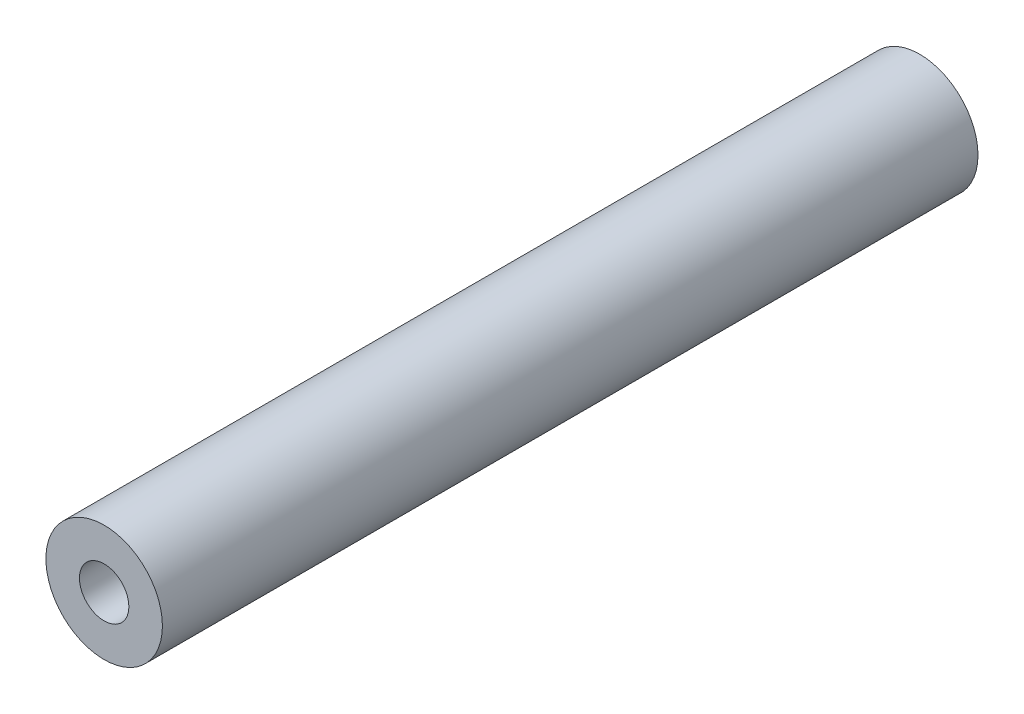
ISO-10303-21;
HEADER;
FILE_DESCRIPTION(('STEP AP214'),'2;1');
FILE_NAME('part.step','',(''),(''),'','','');
FILE_SCHEMA(('AUTOMOTIVE_DESIGN { 1 0 10303 214 1 1 1 1 }'));
ENDSEC;
DATA;
#1=APPLICATION_CONTEXT('core data for automotive mechanical design processes');
#2=APPLICATION_PROTOCOL_DEFINITION('international standard','automotive_design',2000,#1);
#3=PRODUCT_CONTEXT('',#1,'mechanical');
#4=PRODUCT('Part','Part','',(#3));
#5=PRODUCT_RELATED_PRODUCT_CATEGORY('part','',(#4));
#6=PRODUCT_DEFINITION_FORMATION('','',#4);
#7=PRODUCT_DEFINITION_CONTEXT('part definition',#1,'design');
#8=PRODUCT_DEFINITION('design','',#6,#7);
#9=PRODUCT_DEFINITION_SHAPE('','',#8);
#10=(LENGTH_UNIT() NAMED_UNIT(*) SI_UNIT(.MILLI.,.METRE.));
#11=(NAMED_UNIT(*) PLANE_ANGLE_UNIT() SI_UNIT($,.RADIAN.));
#12=(NAMED_UNIT(*) SI_UNIT($,.STERADIAN.) SOLID_ANGLE_UNIT());
#13=UNCERTAINTY_MEASURE_WITH_UNIT(LENGTH_MEASURE(1.E-05),#10,'distance_accuracy_value','');
#14=(GEOMETRIC_REPRESENTATION_CONTEXT(3) GLOBAL_UNCERTAINTY_ASSIGNED_CONTEXT((#13)) GLOBAL_UNIT_ASSIGNED_CONTEXT((#10,
#11,#12)) REPRESENTATION_CONTEXT('',''));
#15=CARTESIAN_POINT('',(0.,0.,0.));
#16=DIRECTION('',(0.,0.,1.));
#17=DIRECTION('',(1.,0.,0.));
#18=AXIS2_PLACEMENT_3D('',#15,#16,#17);
#19=CARTESIAN_POINT('',(0.,0.,33.3375));
#20=DIRECTION('',(0.,0.,-1.));
#21=DIRECTION('',(-1.,0.,0.));
#22=AXIS2_PLACEMENT_3D('',#19,#20,#21);
#23=CYLINDRICAL_SURFACE('',#22,4.7625);
#24=CARTESIAN_POINT('',(0.,0.,33.3375));
#25=DIRECTION('',(0.,0.,1.));
#26=DIRECTION('',(1.,0.,0.));
#27=AXIS2_PLACEMENT_3D('',#24,#25,#26);
#28=CIRCLE('',#27,4.7625);
#29=CARTESIAN_POINT('',(4.7625,0.,33.3375));
#30=VERTEX_POINT('',#29);
#31=EDGE_CURVE('E11',#30,#30,#28,.T.);
#32=ORIENTED_EDGE('',*,*,#31,.F.);
#33=EDGE_LOOP('',(#32));
#34=FACE_BOUND('',#33,.T.);
#35=CARTESIAN_POINT('',(0.,0.,-33.3375));
#36=DIRECTION('',(0.,0.,1.));
#37=DIRECTION('',(1.,0.,0.));
#38=AXIS2_PLACEMENT_3D('',#35,#36,#37);
#39=CIRCLE('',#38,4.7625);
#40=CARTESIAN_POINT('',(4.7625,0.,-33.3375));
#41=VERTEX_POINT('',#40);
#42=EDGE_CURVE('E50',#41,#41,#39,.T.);
#43=ORIENTED_EDGE('',*,*,#42,.T.);
#44=EDGE_LOOP('',(#43));
#45=FACE_BOUND('',#44,.T.);
#46=ADVANCED_FACE('F47',(#34,#45),#23,.T.);
#47=CARTESIAN_POINT('',(0.,0.,33.3375));
#48=DIRECTION('',(0.,0.,1.));
#49=DIRECTION('',(1.,0.,0.));
#50=AXIS2_PLACEMENT_3D('',#47,#48,#49);
#51=PLANE('',#50);
#52=CARTESIAN_POINT('',(0.,0.,33.3375));
#53=DIRECTION('',(0.,0.,1.));
#54=DIRECTION('',(1.,0.,0.));
#55=AXIS2_PLACEMENT_3D('',#52,#53,#54);
#56=CIRCLE('',#55,2.01929999999999);
#57=CARTESIAN_POINT('',(2.01929999999999,0.,33.3375));
#58=VERTEX_POINT('',#57);
#59=EDGE_CURVE('E71',#58,#58,#56,.T.);
#60=ORIENTED_EDGE('',*,*,#59,.F.);
#61=EDGE_LOOP('',(#60));
#62=FACE_BOUND('',#61,.T.);
#63=ORIENTED_EDGE('',*,*,#31,.T.);
#64=EDGE_LOOP('',(#63));
#65=FACE_BOUND('',#64,.T.);
#66=ADVANCED_FACE('F89',(#62,#65),#51,.T.);
#67=CARTESIAN_POINT('',(0.,0.,-33.3375));
#68=DIRECTION('',(0.,0.,1.));
#69=DIRECTION('',(1.,0.,0.));
#70=AXIS2_PLACEMENT_3D('',#67,#68,#69);
#71=PLANE('',#70);
#72=CARTESIAN_POINT('',(0.,0.,-33.3375));
#73=DIRECTION('',(0.,0.,-1.));
#74=DIRECTION('',(-1.,0.,0.));
#75=AXIS2_PLACEMENT_3D('',#72,#73,#74);
#76=CIRCLE('',#75,2.01929999999999);
#77=CARTESIAN_POINT('',(-2.01929999999999,0.,-33.3375));
#78=VERTEX_POINT('',#77);
#79=EDGE_CURVE('E70',#78,#78,#76,.T.);
#80=ORIENTED_EDGE('',*,*,#79,.F.);
#81=EDGE_LOOP('',(#80));
#82=FACE_BOUND('',#81,.T.);
#83=ORIENTED_EDGE('',*,*,#42,.F.);
#84=EDGE_LOOP('',(#83));
#85=FACE_BOUND('',#84,.T.);
#86=ADVANCED_FACE('F86',(#82,#85),#71,.F.);
#87=CARTESIAN_POINT('',(0.,0.,-21.3995));
#88=DIRECTION('',(0.,0.,-1.));
#89=DIRECTION('',(-1.,0.,0.));
#90=AXIS2_PLACEMENT_3D('',#87,#88,#89);
#91=CONICAL_SURFACE('',#90,2.01929999999999,1.02974425867665);
#92=CARTESIAN_POINT('',(0.,0.,-20.1861821519976));
#93=VERTEX_POINT('',#92);
#94=VERTEX_LOOP('',#93);
#95=FACE_BOUND('',#94,.T.);
#96=CARTESIAN_POINT('',(0.,0.,-21.3995));
#97=DIRECTION('',(0.,0.,-1.));
#98=DIRECTION('',(-1.,0.,0.));
#99=AXIS2_PLACEMENT_3D('',#96,#97,#98);
#100=CIRCLE('',#99,2.01929999999999);
#101=CARTESIAN_POINT('',(-2.01929999999999,0.,-21.3995));
#102=VERTEX_POINT('',#101);
#103=EDGE_CURVE('E74',#102,#102,#100,.T.);
#104=ORIENTED_EDGE('',*,*,#103,.T.);
#105=EDGE_LOOP('',(#104));
#106=FACE_BOUND('',#105,.T.);
#107=ADVANCED_FACE('F88',(#95,#106),#91,.F.);
#108=CARTESIAN_POINT('',(0.,0.,-33.3375));
#109=DIRECTION('',(0.,0.,-1.));
#110=DIRECTION('',(-1.,0.,0.));
#111=AXIS2_PLACEMENT_3D('',#108,#109,#110);
#112=CYLINDRICAL_SURFACE('',#111,2.01929999999999);
#113=ORIENTED_EDGE('',*,*,#103,.F.);
#114=EDGE_LOOP('',(#113));
#115=FACE_BOUND('',#114,.T.);
#116=ORIENTED_EDGE('',*,*,#79,.T.);
#117=EDGE_LOOP('',(#116));
#118=FACE_BOUND('',#117,.T.);
#119=ADVANCED_FACE('F64',(#115,#118),#112,.F.);
#120=CARTESIAN_POINT('',(0.,0.,21.3995));
#121=DIRECTION('',(0.,0.,1.));
#122=DIRECTION('',(1.,0.,0.));
#123=AXIS2_PLACEMENT_3D('',#120,#121,#122);
#124=CONICAL_SURFACE('',#123,2.01929999999999,1.02974425867665);
#125=CARTESIAN_POINT('',(0.,0.,20.1861821519976));
#126=VERTEX_POINT('',#125);
#127=VERTEX_LOOP('',#126);
#128=FACE_BOUND('',#127,.T.);
#129=CARTESIAN_POINT('',(0.,0.,21.3995));
#130=DIRECTION('',(0.,0.,1.));
#131=DIRECTION('',(1.,0.,0.));
#132=AXIS2_PLACEMENT_3D('',#129,#130,#131);
#133=CIRCLE('',#132,2.01929999999999);
#134=CARTESIAN_POINT('',(2.01929999999999,0.,21.3995));
#135=VERTEX_POINT('',#134);
#136=EDGE_CURVE('E68',#135,#135,#133,.T.);
#137=ORIENTED_EDGE('',*,*,#136,.T.);
#138=EDGE_LOOP('',(#137));
#139=FACE_BOUND('',#138,.T.);
#140=ADVANCED_FACE('F60',(#128,#139),#124,.F.);
#141=CARTESIAN_POINT('',(0.,0.,33.3375));
#142=DIRECTION('',(0.,0.,1.));
#143=DIRECTION('',(1.,0.,0.));
#144=AXIS2_PLACEMENT_3D('',#141,#142,#143);
#145=CYLINDRICAL_SURFACE('',#144,2.01929999999999);
#146=ORIENTED_EDGE('',*,*,#136,.F.);
#147=EDGE_LOOP('',(#146));
#148=FACE_BOUND('',#147,.T.);
#149=ORIENTED_EDGE('',*,*,#59,.T.);
#150=EDGE_LOOP('',(#149));
#151=FACE_BOUND('',#150,.T.);
#152=ADVANCED_FACE('F63',(#148,#151),#145,.F.);
#153=CLOSED_SHELL('',(#46,#66,#86,#107,#119,#140,#152));
#154=MANIFOLD_SOLID_BREP('B2',#153);
#155=ADVANCED_BREP_SHAPE_REPRESENTATION('',(#18,#154),#14);
#156=SHAPE_DEFINITION_REPRESENTATION(#9,#155);
ENDSEC;
END-ISO-10303-21;
